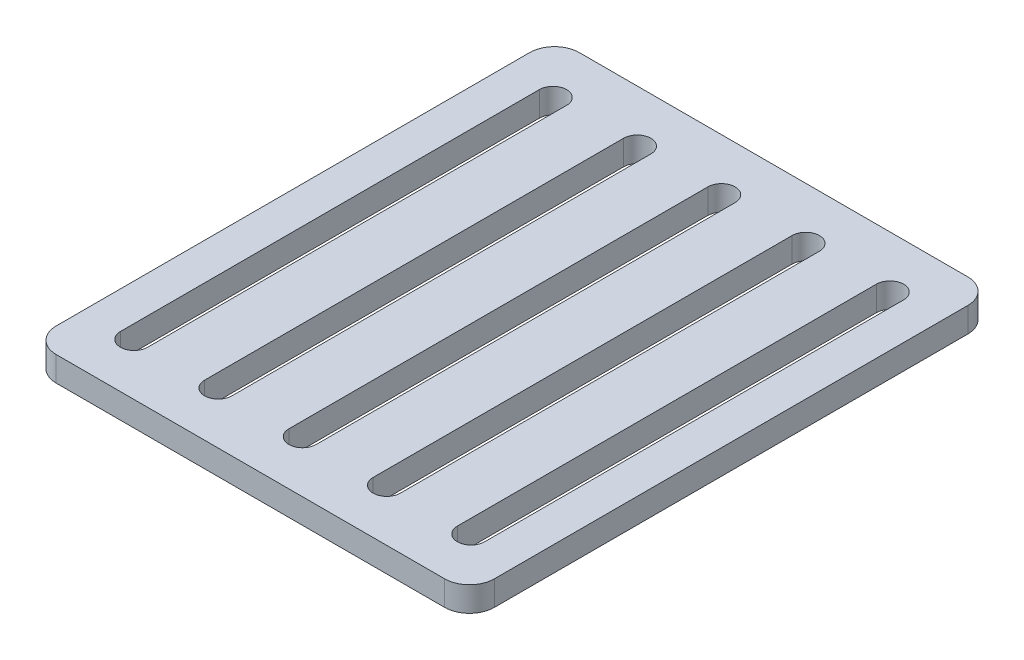
ISO-10303-21;
HEADER;
FILE_DESCRIPTION(('STEP AP214'),'2;1');
FILE_NAME('part.step','',(''),(''),'','','');
FILE_SCHEMA(('AUTOMOTIVE_DESIGN { 1 0 10303 214 1 1 1 1 }'));
ENDSEC;
DATA;
#1=APPLICATION_CONTEXT('core data for automotive mechanical design processes');
#2=APPLICATION_PROTOCOL_DEFINITION('international standard','automotive_design',2000,#1);
#3=PRODUCT_CONTEXT('',#1,'mechanical');
#4=PRODUCT('Part','Part','',(#3));
#5=PRODUCT_RELATED_PRODUCT_CATEGORY('part','',(#4));
#6=PRODUCT_DEFINITION_FORMATION('','',#4);
#7=PRODUCT_DEFINITION_CONTEXT('part definition',#1,'design');
#8=PRODUCT_DEFINITION('design','',#6,#7);
#9=PRODUCT_DEFINITION_SHAPE('','',#8);
#10=(LENGTH_UNIT() NAMED_UNIT(*) SI_UNIT(.MILLI.,.METRE.));
#11=(NAMED_UNIT(*) PLANE_ANGLE_UNIT() SI_UNIT($,.RADIAN.));
#12=(NAMED_UNIT(*) SI_UNIT($,.STERADIAN.) SOLID_ANGLE_UNIT());
#13=UNCERTAINTY_MEASURE_WITH_UNIT(LENGTH_MEASURE(1.E-05),#10,'distance_accuracy_value','');
#14=(GEOMETRIC_REPRESENTATION_CONTEXT(3) GLOBAL_UNCERTAINTY_ASSIGNED_CONTEXT((#13)) GLOBAL_UNIT_ASSIGNED_CONTEXT((#10,
#11,#12)) REPRESENTATION_CONTEXT('',''));
#15=CARTESIAN_POINT('',(0.,0.,0.));
#16=DIRECTION('',(0.,0.,1.));
#17=DIRECTION('',(1.,0.,0.));
#18=AXIS2_PLACEMENT_3D('',#15,#16,#17);
#19=CARTESIAN_POINT('',(44.1988373664787,15.5,0.));
#20=DIRECTION('',(1.,0.,0.));
#21=DIRECTION('',(0.,0.,-1.));
#22=AXIS2_PLACEMENT_3D('',#19,#20,#21);
#23=PLANE('',#22);
#24=DIRECTION('',(0.,0.,1.));
#25=VECTOR('',#24,1.);
#26=CARTESIAN_POINT('',(44.1988373664787,20.5,0.));
#27=LINE('',#26,#25);
#28=CARTESIAN_POINT('',(44.1988373664787,20.5,-52.7238001027068));
#29=VERTEX_POINT('',#28);
#30=CARTESIAN_POINT('',(44.1988373664787,20.5,42.8226002054125));
#31=VERTEX_POINT('',#30);
#32=EDGE_CURVE('E362',#29,#31,#27,.T.);
#33=ORIENTED_EDGE('',*,*,#32,.T.);
#34=DIRECTION('',(0.,-1.,0.));
#35=VECTOR('',#34,1.);
#36=CARTESIAN_POINT('',(44.1988373664787,15.5,42.8226002054125));
#37=LINE('',#36,#35);
#38=CARTESIAN_POINT('',(44.1988373664787,15.5,42.8226002054125));
#39=VERTEX_POINT('',#38);
#40=EDGE_CURVE('E261',#31,#39,#37,.T.);
#41=ORIENTED_EDGE('',*,*,#40,.T.);
#42=DIRECTION('',(0.,0.,1.));
#43=VECTOR('',#42,1.);
#44=CARTESIAN_POINT('',(44.1988373664787,15.5,0.));
#45=LINE('',#44,#43);
#46=CARTESIAN_POINT('',(44.1988373664787,15.5,-52.7238001027068));
#47=VERTEX_POINT('',#46);
#48=EDGE_CURVE('E305',#47,#39,#45,.T.);
#49=ORIENTED_EDGE('',*,*,#48,.F.);
#50=DIRECTION('',(0.,-1.,0.));
#51=VECTOR('',#50,1.);
#52=CARTESIAN_POINT('',(44.1988373664787,15.5,-52.7238001027068));
#53=LINE('',#52,#51);
#54=EDGE_CURVE('E259',#47,#29,#53,.F.);
#55=ORIENTED_EDGE('',*,*,#54,.T.);
#56=EDGE_LOOP('',(#33,#41,#49,#55));
#57=FACE_BOUND('',#56,.T.);
#58=ADVANCED_FACE('F37',(#57),#23,.T.);
#59=CARTESIAN_POINT('',(0.,15.5,-57.7238001027068));
#60=DIRECTION('',(0.,0.,-1.));
#61=DIRECTION('',(-1.,0.,0.));
#62=AXIS2_PLACEMENT_3D('',#59,#60,#61);
#63=PLANE('',#62);
#64=DIRECTION('',(1.,0.,0.));
#65=VECTOR('',#64,1.);
#66=CARTESIAN_POINT('',(0.,20.5,-57.7238001027068));
#67=LINE('',#66,#65);
#68=CARTESIAN_POINT('',(-39.1988373664787,20.5,-57.7238001027068));
#69=VERTEX_POINT('',#68);
#70=CARTESIAN_POINT('',(39.1988373664787,20.5,-57.7238001027068));
#71=VERTEX_POINT('',#70);
#72=EDGE_CURVE('E297',#69,#71,#67,.T.);
#73=ORIENTED_EDGE('',*,*,#72,.T.);
#74=DIRECTION('',(0.,-1.,0.));
#75=VECTOR('',#74,1.);
#76=CARTESIAN_POINT('',(39.1988373664787,15.5,-57.7238001027068));
#77=LINE('',#76,#75);
#78=CARTESIAN_POINT('',(39.1988373664787,15.5,-57.7238001027068));
#79=VERTEX_POINT('',#78);
#80=EDGE_CURVE('E287',#71,#79,#77,.T.);
#81=ORIENTED_EDGE('',*,*,#80,.T.);
#82=DIRECTION('',(1.,0.,0.));
#83=VECTOR('',#82,1.);
#84=CARTESIAN_POINT('',(0.,15.5,-57.7238001027068));
#85=LINE('',#84,#83);
#86=CARTESIAN_POINT('',(-39.1988373664787,15.5,-57.7238001027068));
#87=VERTEX_POINT('',#86);
#88=EDGE_CURVE('E295',#87,#79,#85,.T.);
#89=ORIENTED_EDGE('',*,*,#88,.F.);
#90=DIRECTION('',(0.,-1.,0.));
#91=VECTOR('',#90,1.);
#92=CARTESIAN_POINT('',(-39.1988373664787,20.5,-57.7238001027068));
#93=LINE('',#92,#91);
#94=EDGE_CURVE('E285',#87,#69,#93,.F.);
#95=ORIENTED_EDGE('',*,*,#94,.T.);
#96=EDGE_LOOP('',(#73,#81,#89,#95));
#97=FACE_BOUND('',#96,.T.);
#98=ADVANCED_FACE('F294',(#97),#63,.T.);
#99=CARTESIAN_POINT('',(-44.1988373664787,15.5,0.));
#100=DIRECTION('',(1.,0.,0.));
#101=DIRECTION('',(0.,0.,-1.));
#102=AXIS2_PLACEMENT_3D('',#99,#100,#101);
#103=PLANE('',#102);
#104=DIRECTION('',(0.,0.,1.));
#105=VECTOR('',#104,1.);
#106=CARTESIAN_POINT('',(-44.1988373664787,20.5,0.));
#107=LINE('',#106,#105);
#108=CARTESIAN_POINT('',(-44.1988373664787,20.5,-52.7238001027068));
#109=VERTEX_POINT('',#108);
#110=CARTESIAN_POINT('',(-44.1988373664787,20.5,42.8226002054125));
#111=VERTEX_POINT('',#110);
#112=EDGE_CURVE('E366',#109,#111,#107,.T.);
#113=ORIENTED_EDGE('',*,*,#112,.F.);
#114=DIRECTION('',(0.,-1.,0.));
#115=VECTOR('',#114,1.);
#116=CARTESIAN_POINT('',(-44.1988373664787,15.5,-52.7238001027068));
#117=LINE('',#116,#115);
#118=CARTESIAN_POINT('',(-44.1988373664787,15.5,-52.7238001027068));
#119=VERTEX_POINT('',#118);
#120=EDGE_CURVE('E11',#109,#119,#117,.T.);
#121=ORIENTED_EDGE('',*,*,#120,.T.);
#122=DIRECTION('',(0.,0.,1.));
#123=VECTOR('',#122,1.);
#124=CARTESIAN_POINT('',(-44.1988373664787,15.5,0.));
#125=LINE('',#124,#123);
#126=CARTESIAN_POINT('',(-44.1988373664787,15.5,42.8226002054125));
#127=VERTEX_POINT('',#126);
#128=EDGE_CURVE('E306',#119,#127,#125,.T.);
#129=ORIENTED_EDGE('',*,*,#128,.T.);
#130=DIRECTION('',(0.,-1.,0.));
#131=VECTOR('',#130,1.);
#132=CARTESIAN_POINT('',(-44.1988373664787,15.5,42.8226002054125));
#133=LINE('',#132,#131);
#134=EDGE_CURVE('E45',#127,#111,#133,.F.);
#135=ORIENTED_EDGE('',*,*,#134,.T.);
#136=EDGE_LOOP('',(#113,#121,#129,#135));
#137=FACE_BOUND('',#136,.T.);
#138=ADVANCED_FACE('F493',(#137),#103,.F.);
#139=CARTESIAN_POINT('',(0.,15.5,47.8226002054125));
#140=DIRECTION('',(0.,0.,-1.));
#141=DIRECTION('',(-1.,0.,0.));
#142=AXIS2_PLACEMENT_3D('',#139,#140,#141);
#143=PLANE('',#142);
#144=DIRECTION('',(1.,0.,0.));
#145=VECTOR('',#144,1.);
#146=CARTESIAN_POINT('',(0.,15.5,47.8226002054125));
#147=LINE('',#146,#145);
#148=CARTESIAN_POINT('',(-39.1988373664787,15.5,47.8226002054125));
#149=VERTEX_POINT('',#148);
#150=CARTESIAN_POINT('',(39.1988373664787,15.5,47.8226002054125));
#151=VERTEX_POINT('',#150);
#152=EDGE_CURVE('E309',#149,#151,#147,.T.);
#153=ORIENTED_EDGE('',*,*,#152,.T.);
#154=DIRECTION('',(0.,-1.,0.));
#155=VECTOR('',#154,1.);
#156=CARTESIAN_POINT('',(39.1988373664787,20.5,47.8226002054125));
#157=LINE('',#156,#155);
#158=CARTESIAN_POINT('',(39.1988373664787,20.5,47.8226002054125));
#159=VERTEX_POINT('',#158);
#160=EDGE_CURVE('E276',#151,#159,#157,.F.);
#161=ORIENTED_EDGE('',*,*,#160,.T.);
#162=DIRECTION('',(1.,0.,0.));
#163=VECTOR('',#162,1.);
#164=CARTESIAN_POINT('',(0.,20.5,47.8226002054125));
#165=LINE('',#164,#163);
#166=CARTESIAN_POINT('',(-39.1988373664787,20.5,47.8226002054125));
#167=VERTEX_POINT('',#166);
#168=EDGE_CURVE('E252',#167,#159,#165,.T.);
#169=ORIENTED_EDGE('',*,*,#168,.F.);
#170=DIRECTION('',(0.,-1.,0.));
#171=VECTOR('',#170,1.);
#172=CARTESIAN_POINT('',(-39.1988373664787,15.5,47.8226002054125));
#173=LINE('',#172,#171);
#174=EDGE_CURVE('E273',#167,#149,#173,.T.);
#175=ORIENTED_EDGE('',*,*,#174,.T.);
#176=EDGE_LOOP('',(#153,#161,#169,#175));
#177=FACE_BOUND('',#176,.T.);
#178=ADVANCED_FACE('F517',(#177),#143,.F.);
#179=CARTESIAN_POINT('',(-34.0000000000003,20.5,-47.2238001027059));
#180=DIRECTION('',(0.,-1.,0.));
#181=DIRECTION('',(0.,0.,-1.));
#182=AXIS2_PLACEMENT_3D('',#179,#180,#181);
#183=CYLINDRICAL_SURFACE('',#182,2.75);
#184=CARTESIAN_POINT('',(-34.0000000000003,15.5,-47.2238001027059));
#185=DIRECTION('',(0.,1.,0.));
#186=DIRECTION('',(0.,0.,1.));
#187=AXIS2_PLACEMENT_3D('',#184,#185,#186);
#188=CIRCLE('',#187,2.75);
#189=CARTESIAN_POINT('',(-31.2500000000002,15.5,-47.2238001027059));
#190=VERTEX_POINT('',#189);
#191=CARTESIAN_POINT('',(-36.7500000000003,15.5,-47.2238001027059));
#192=VERTEX_POINT('',#191);
#193=EDGE_CURVE('E401',#190,#192,#188,.T.);
#194=ORIENTED_EDGE('',*,*,#193,.F.);
#195=DIRECTION('',(0.,-1.,0.));
#196=VECTOR('',#195,1.);
#197=CARTESIAN_POINT('',(-31.2500000000002,20.5,-47.2238001027059));
#198=LINE('',#197,#196);
#199=CARTESIAN_POINT('',(-31.2500000000002,20.5,-47.2238001027059));
#200=VERTEX_POINT('',#199);
#201=EDGE_CURVE('E262',#200,#190,#198,.T.);
#202=ORIENTED_EDGE('',*,*,#201,.F.);
#203=CARTESIAN_POINT('',(-34.0000000000003,20.5,-47.2238001027059));
#204=DIRECTION('',(0.,1.,0.));
#205=DIRECTION('',(0.,0.,1.));
#206=AXIS2_PLACEMENT_3D('',#203,#204,#205);
#207=CIRCLE('',#206,2.75);
#208=CARTESIAN_POINT('',(-36.7500000000003,20.5,-47.2238001027059));
#209=VERTEX_POINT('',#208);
#210=EDGE_CURVE('E352',#200,#209,#207,.T.);
#211=ORIENTED_EDGE('',*,*,#210,.T.);
#212=DIRECTION('',(0.,-1.,0.));
#213=VECTOR('',#212,1.);
#214=CARTESIAN_POINT('',(-36.7500000000003,20.5,-47.2238001027059));
#215=LINE('',#214,#213);
#216=EDGE_CURVE('E410',#209,#192,#215,.T.);
#217=ORIENTED_EDGE('',*,*,#216,.T.);
#218=EDGE_LOOP('',(#194,#202,#211,#217));
#219=FACE_BOUND('',#218,.T.);
#220=ADVANCED_FACE('F544',(#219),#183,.F.);
#221=CARTESIAN_POINT('',(-31.2499999999998,20.5,3.12899578364497E-13));
#222=DIRECTION('',(1.,0.,0.));
#223=DIRECTION('',(0.,0.,-1.));
#224=AXIS2_PLACEMENT_3D('',#221,#222,#223);
#225=PLANE('',#224);
#226=DIRECTION('',(0.,0.,1.));
#227=VECTOR('',#226,1.);
#228=CARTESIAN_POINT('',(-31.2499999999998,15.5,3.12899578364497E-13));
#229=LINE('',#228,#227);
#230=CARTESIAN_POINT('',(-31.2499999999994,15.5,37.3226002054122));
#231=VERTEX_POINT('',#230);
#232=EDGE_CURVE('E403',#190,#231,#229,.T.);
#233=ORIENTED_EDGE('',*,*,#232,.T.);
#234=DIRECTION('',(0.,-1.,0.));
#235=VECTOR('',#234,1.);
#236=CARTESIAN_POINT('',(-31.2499999999994,20.5,37.3226002054122));
#237=LINE('',#236,#235);
#238=CARTESIAN_POINT('',(-31.2499999999994,20.5,37.3226002054122));
#239=VERTEX_POINT('',#238);
#240=EDGE_CURVE('E417',#239,#231,#237,.T.);
#241=ORIENTED_EDGE('',*,*,#240,.F.);
#242=DIRECTION('',(0.,0.,1.));
#243=VECTOR('',#242,1.);
#244=CARTESIAN_POINT('',(-31.2499999999998,20.5,3.12899578364497E-13));
#245=LINE('',#244,#243);
#246=EDGE_CURVE('E355',#200,#239,#245,.T.);
#247=ORIENTED_EDGE('',*,*,#246,.F.);
#248=ORIENTED_EDGE('',*,*,#201,.T.);
#249=EDGE_LOOP('',(#233,#241,#247,#248));
#250=FACE_BOUND('',#249,.T.);
#251=ADVANCED_FACE('F540',(#250),#225,.F.);
#252=CARTESIAN_POINT('',(-33.9999999999994,20.5,37.3226002054122));
#253=DIRECTION('',(0.,-1.,0.));
#254=DIRECTION('',(0.,0.,-1.));
#255=AXIS2_PLACEMENT_3D('',#252,#253,#254);
#256=CYLINDRICAL_SURFACE('',#255,2.75);
#257=CARTESIAN_POINT('',(-33.9999999999994,15.5,37.3226002054122));
#258=DIRECTION('',(0.,1.,0.));
#259=DIRECTION('',(0.,0.,1.));
#260=AXIS2_PLACEMENT_3D('',#257,#258,#259);
#261=CIRCLE('',#260,2.75);
#262=CARTESIAN_POINT('',(-36.7499999999994,15.5,37.3226002054122));
#263=VERTEX_POINT('',#262);
#264=EDGE_CURVE('E406',#263,#231,#261,.T.);
#265=ORIENTED_EDGE('',*,*,#264,.F.);
#266=DIRECTION('',(0.,-1.,0.));
#267=VECTOR('',#266,1.);
#268=CARTESIAN_POINT('',(-36.7499999999994,20.5,37.3226002054122));
#269=LINE('',#268,#267);
#270=CARTESIAN_POINT('',(-36.7499999999994,20.5,37.3226002054122));
#271=VERTEX_POINT('',#270);
#272=EDGE_CURVE('E413',#271,#263,#269,.T.);
#273=ORIENTED_EDGE('',*,*,#272,.F.);
#274=CARTESIAN_POINT('',(-33.9999999999994,20.5,37.3226002054122));
#275=DIRECTION('',(0.,1.,0.));
#276=DIRECTION('',(0.,0.,1.));
#277=AXIS2_PLACEMENT_3D('',#274,#275,#276);
#278=CIRCLE('',#277,2.75);
#279=EDGE_CURVE('E357',#271,#239,#278,.T.);
#280=ORIENTED_EDGE('',*,*,#279,.T.);
#281=ORIENTED_EDGE('',*,*,#240,.T.);
#282=EDGE_LOOP('',(#265,#273,#280,#281));
#283=FACE_BOUND('',#282,.T.);
#284=ADVANCED_FACE('F536',(#283),#256,.F.);
#285=CARTESIAN_POINT('',(-17.0000000000004,20.5,-47.2238001027059));
#286=DIRECTION('',(0.,-1.,0.));
#287=DIRECTION('',(0.,0.,-1.));
#288=AXIS2_PLACEMENT_3D('',#285,#286,#287);
#289=CYLINDRICAL_SURFACE('',#288,2.75);
#290=CARTESIAN_POINT('',(-17.0000000000004,15.5,-47.2238001027059));
#291=DIRECTION('',(0.,1.,0.));
#292=DIRECTION('',(0.,0.,1.));
#293=AXIS2_PLACEMENT_3D('',#290,#291,#292);
#294=CIRCLE('',#293,2.75);
#295=CARTESIAN_POINT('',(-14.2500000000004,15.5,-47.2238001027059));
#296=VERTEX_POINT('',#295);
#297=CARTESIAN_POINT('',(-19.7500000000004,15.5,-47.2238001027059));
#298=VERTEX_POINT('',#297);
#299=EDGE_CURVE('E391',#296,#298,#294,.T.);
#300=ORIENTED_EDGE('',*,*,#299,.F.);
#301=DIRECTION('',(0.,-1.,0.));
#302=VECTOR('',#301,1.);
#303=CARTESIAN_POINT('',(-14.2500000000004,20.5,-47.2238001027059));
#304=LINE('',#303,#302);
#305=CARTESIAN_POINT('',(-14.2500000000004,20.5,-47.2238001027059));
#306=VERTEX_POINT('',#305);
#307=EDGE_CURVE('E414',#306,#296,#304,.T.);
#308=ORIENTED_EDGE('',*,*,#307,.F.);
#309=CARTESIAN_POINT('',(-17.0000000000004,20.5,-47.2238001027059));
#310=DIRECTION('',(0.,1.,0.));
#311=DIRECTION('',(0.,0.,1.));
#312=AXIS2_PLACEMENT_3D('',#309,#310,#311);
#313=CIRCLE('',#312,2.75);
#314=CARTESIAN_POINT('',(-19.7500000000004,20.5,-47.2238001027059));
#315=VERTEX_POINT('',#314);
#316=EDGE_CURVE('E342',#306,#315,#313,.T.);
#317=ORIENTED_EDGE('',*,*,#316,.T.);
#318=DIRECTION('',(0.,-1.,0.));
#319=VECTOR('',#318,1.);
#320=CARTESIAN_POINT('',(-19.7500000000004,20.5,-47.2238001027059));
#321=LINE('',#320,#319);
#322=EDGE_CURVE('E422',#315,#298,#321,.T.);
#323=ORIENTED_EDGE('',*,*,#322,.T.);
#324=EDGE_LOOP('',(#300,#308,#317,#323));
#325=FACE_BOUND('',#324,.T.);
#326=ADVANCED_FACE('F539',(#325),#289,.F.);
#327=CARTESIAN_POINT('',(-14.2499999999999,20.5,1.42682207734211E-13));
#328=DIRECTION('',(1.,0.,0.));
#329=DIRECTION('',(0.,0.,-1.));
#330=AXIS2_PLACEMENT_3D('',#327,#328,#329);
#331=PLANE('',#330);
#332=DIRECTION('',(0.,0.,1.));
#333=VECTOR('',#332,1.);
#334=CARTESIAN_POINT('',(-14.2499999999999,15.5,1.42682207734211E-13));
#335=LINE('',#334,#333);
#336=CARTESIAN_POINT('',(-14.2499999999996,15.5,37.3226002054122));
#337=VERTEX_POINT('',#336);
#338=EDGE_CURVE('E393',#296,#337,#335,.T.);
#339=ORIENTED_EDGE('',*,*,#338,.T.);
#340=DIRECTION('',(0.,-1.,0.));
#341=VECTOR('',#340,1.);
#342=CARTESIAN_POINT('',(-14.2499999999996,20.5,37.3226002054122));
#343=LINE('',#342,#341);
#344=CARTESIAN_POINT('',(-14.2499999999996,20.5,37.3226002054122));
#345=VERTEX_POINT('',#344);
#346=EDGE_CURVE('E429',#345,#337,#343,.T.);
#347=ORIENTED_EDGE('',*,*,#346,.F.);
#348=DIRECTION('',(0.,0.,1.));
#349=VECTOR('',#348,1.);
#350=CARTESIAN_POINT('',(-14.2499999999999,20.5,1.42682207734211E-13));
#351=LINE('',#350,#349);
#352=EDGE_CURVE('E345',#306,#345,#351,.T.);
#353=ORIENTED_EDGE('',*,*,#352,.F.);
#354=ORIENTED_EDGE('',*,*,#307,.T.);
#355=EDGE_LOOP('',(#339,#347,#353,#354));
#356=FACE_BOUND('',#355,.T.);
#357=ADVANCED_FACE('F556',(#356),#331,.F.);
#358=CARTESIAN_POINT('',(-16.9999999999996,20.5,37.3226002054122));
#359=DIRECTION('',(0.,-1.,0.));
#360=DIRECTION('',(0.,0.,-1.));
#361=AXIS2_PLACEMENT_3D('',#358,#359,#360);
#362=CYLINDRICAL_SURFACE('',#361,2.75);
#363=CARTESIAN_POINT('',(-16.9999999999996,15.5,37.3226002054122));
#364=DIRECTION('',(0.,1.,0.));
#365=DIRECTION('',(0.,0.,1.));
#366=AXIS2_PLACEMENT_3D('',#363,#364,#365);
#367=CIRCLE('',#366,2.75);
#368=CARTESIAN_POINT('',(-19.7499999999996,15.5,37.3226002054122));
#369=VERTEX_POINT('',#368);
#370=EDGE_CURVE('E396',#369,#337,#367,.T.);
#371=ORIENTED_EDGE('',*,*,#370,.F.);
#372=DIRECTION('',(0.,-1.,0.));
#373=VECTOR('',#372,1.);
#374=CARTESIAN_POINT('',(-19.7499999999996,20.5,37.3226002054122));
#375=LINE('',#374,#373);
#376=CARTESIAN_POINT('',(-19.7499999999996,20.5,37.3226002054122));
#377=VERTEX_POINT('',#376);
#378=EDGE_CURVE('E425',#377,#369,#375,.T.);
#379=ORIENTED_EDGE('',*,*,#378,.F.);
#380=CARTESIAN_POINT('',(-16.9999999999996,20.5,37.3226002054122));
#381=DIRECTION('',(0.,1.,0.));
#382=DIRECTION('',(0.,0.,1.));
#383=AXIS2_PLACEMENT_3D('',#380,#381,#382);
#384=CIRCLE('',#383,2.75);
#385=EDGE_CURVE('E347',#377,#345,#384,.T.);
#386=ORIENTED_EDGE('',*,*,#385,.T.);
#387=ORIENTED_EDGE('',*,*,#346,.T.);
#388=EDGE_LOOP('',(#371,#379,#386,#387));
#389=FACE_BOUND('',#388,.T.);
#390=ADVANCED_FACE('F552',(#389),#362,.F.);
#391=CARTESIAN_POINT('',(-5.68989300120393E-13,20.5,-47.2238001027059));
#392=DIRECTION('',(0.,-1.,0.));
#393=DIRECTION('',(0.,0.,-1.));
#394=AXIS2_PLACEMENT_3D('',#391,#392,#393);
#395=CYLINDRICAL_SURFACE('',#394,2.75);
#396=CARTESIAN_POINT('',(-5.68989300120393E-13,15.5,-47.2238001027059));
#397=DIRECTION('',(0.,1.,0.));
#398=DIRECTION('',(0.,0.,1.));
#399=AXIS2_PLACEMENT_3D('',#396,#397,#398);
#400=CIRCLE('',#399,2.75);
#401=CARTESIAN_POINT('',(2.74999999999943,15.5,-47.2238001027059));
#402=VERTEX_POINT('',#401);
#403=CARTESIAN_POINT('',(-2.75000000000057,15.5,-47.2238001027059));
#404=VERTEX_POINT('',#403);
#405=EDGE_CURVE('E381',#402,#404,#400,.T.);
#406=ORIENTED_EDGE('',*,*,#405,.F.);
#407=DIRECTION('',(0.,-1.,0.));
#408=VECTOR('',#407,1.);
#409=CARTESIAN_POINT('',(2.74999999999943,20.5,-47.2238001027059));
#410=LINE('',#409,#408);
#411=CARTESIAN_POINT('',(2.74999999999943,20.5,-47.2238001027059));
#412=VERTEX_POINT('',#411);
#413=EDGE_CURVE('E426',#412,#402,#410,.T.);
#414=ORIENTED_EDGE('',*,*,#413,.F.);
#415=CARTESIAN_POINT('',(-5.68989300120393E-13,20.5,-47.2238001027059));
#416=DIRECTION('',(0.,1.,0.));
#417=DIRECTION('',(0.,0.,1.));
#418=AXIS2_PLACEMENT_3D('',#415,#416,#417);
#419=CIRCLE('',#418,2.75);
#420=CARTESIAN_POINT('',(-2.75000000000057,20.5,-47.2238001027059));
#421=VERTEX_POINT('',#420);
#422=EDGE_CURVE('E332',#412,#421,#419,.T.);
#423=ORIENTED_EDGE('',*,*,#422,.T.);
#424=DIRECTION('',(0.,-1.,0.));
#425=VECTOR('',#424,1.);
#426=CARTESIAN_POINT('',(-2.75000000000057,20.5,-47.2238001027059));
#427=LINE('',#426,#425);
#428=EDGE_CURVE('E434',#421,#404,#427,.T.);
#429=ORIENTED_EDGE('',*,*,#428,.T.);
#430=EDGE_LOOP('',(#406,#414,#423,#429));
#431=FACE_BOUND('',#430,.T.);
#432=ADVANCED_FACE('F555',(#431),#395,.F.);
#433=CARTESIAN_POINT('',(2.74999999999991,20.5,0.));
#434=DIRECTION('',(1.,0.,0.));
#435=DIRECTION('',(0.,0.,-1.));
#436=AXIS2_PLACEMENT_3D('',#433,#434,#435);
#437=PLANE('',#436);
#438=DIRECTION('',(0.,0.,1.));
#439=VECTOR('',#438,1.);
#440=CARTESIAN_POINT('',(2.74999999999991,15.5,0.));
#441=LINE('',#440,#439);
#442=CARTESIAN_POINT('',(2.75000000000028,15.5,37.3226002054122));
#443=VERTEX_POINT('',#442);
#444=EDGE_CURVE('E383',#402,#443,#441,.T.);
#445=ORIENTED_EDGE('',*,*,#444,.T.);
#446=DIRECTION('',(0.,-1.,0.));
#447=VECTOR('',#446,1.);
#448=CARTESIAN_POINT('',(2.75000000000028,20.5,37.3226002054122));
#449=LINE('',#448,#447);
#450=CARTESIAN_POINT('',(2.75000000000028,20.5,37.3226002054122));
#451=VERTEX_POINT('',#450);
#452=EDGE_CURVE('E441',#451,#443,#449,.T.);
#453=ORIENTED_EDGE('',*,*,#452,.F.);
#454=DIRECTION('',(0.,0.,1.));
#455=VECTOR('',#454,1.);
#456=CARTESIAN_POINT('',(2.74999999999991,20.5,0.));
#457=LINE('',#456,#455);
#458=EDGE_CURVE('E335',#412,#451,#457,.T.);
#459=ORIENTED_EDGE('',*,*,#458,.F.);
#460=ORIENTED_EDGE('',*,*,#413,.T.);
#461=EDGE_LOOP('',(#445,#453,#459,#460));
#462=FACE_BOUND('',#461,.T.);
#463=ADVANCED_FACE('F567',(#462),#437,.F.);
#464=CARTESIAN_POINT('',(2.77555756156289E-13,20.5,37.3226002054122));
#465=DIRECTION('',(0.,-1.,0.));
#466=DIRECTION('',(0.,0.,-1.));
#467=AXIS2_PLACEMENT_3D('',#464,#465,#466);
#468=CYLINDRICAL_SURFACE('',#467,2.75);
#469=CARTESIAN_POINT('',(2.77555756156289E-13,15.5,37.3226002054122));
#470=DIRECTION('',(0.,1.,0.));
#471=DIRECTION('',(0.,0.,1.));
#472=AXIS2_PLACEMENT_3D('',#469,#470,#471);
#473=CIRCLE('',#472,2.75);
#474=CARTESIAN_POINT('',(-2.74999999999972,15.5,37.3226002054122));
#475=VERTEX_POINT('',#474);
#476=EDGE_CURVE('E386',#475,#443,#473,.T.);
#477=ORIENTED_EDGE('',*,*,#476,.F.);
#478=DIRECTION('',(0.,-1.,0.));
#479=VECTOR('',#478,1.);
#480=CARTESIAN_POINT('',(-2.74999999999972,20.5,37.3226002054122));
#481=LINE('',#480,#479);
#482=CARTESIAN_POINT('',(-2.74999999999972,20.5,37.3226002054122));
#483=VERTEX_POINT('',#482);
#484=EDGE_CURVE('E437',#483,#475,#481,.T.);
#485=ORIENTED_EDGE('',*,*,#484,.F.);
#486=CARTESIAN_POINT('',(2.77555756156289E-13,20.5,37.3226002054122));
#487=DIRECTION('',(0.,1.,0.));
#488=DIRECTION('',(0.,0.,1.));
#489=AXIS2_PLACEMENT_3D('',#486,#487,#488);
#490=CIRCLE('',#489,2.75);
#491=EDGE_CURVE('E337',#483,#451,#490,.T.);
#492=ORIENTED_EDGE('',*,*,#491,.T.);
#493=ORIENTED_EDGE('',*,*,#452,.T.);
#494=EDGE_LOOP('',(#477,#485,#492,#493));
#495=FACE_BOUND('',#494,.T.);
#496=ADVANCED_FACE('F564',(#495),#468,.F.);
#497=CARTESIAN_POINT('',(16.9999999999993,20.5,-47.2238001027059));
#498=DIRECTION('',(0.,-1.,0.));
#499=DIRECTION('',(0.,0.,-1.));
#500=AXIS2_PLACEMENT_3D('',#497,#498,#499);
#501=CYLINDRICAL_SURFACE('',#500,2.75);
#502=CARTESIAN_POINT('',(16.9999999999993,15.5,-47.2238001027059));
#503=DIRECTION('',(0.,1.,0.));
#504=DIRECTION('',(0.,0.,1.));
#505=AXIS2_PLACEMENT_3D('',#502,#503,#504);
#506=CIRCLE('',#505,2.75);
#507=CARTESIAN_POINT('',(19.7499999999993,15.5,-47.2238001027059));
#508=VERTEX_POINT('',#507);
#509=CARTESIAN_POINT('',(14.2499999999993,15.5,-47.2238001027059));
#510=VERTEX_POINT('',#509);
#511=EDGE_CURVE('E233',#508,#510,#506,.T.);
#512=ORIENTED_EDGE('',*,*,#511,.F.);
#513=DIRECTION('',(0.,-1.,0.));
#514=VECTOR('',#513,1.);
#515=CARTESIAN_POINT('',(19.7499999999993,20.5,-47.2238001027059));
#516=LINE('',#515,#514);
#517=CARTESIAN_POINT('',(19.7499999999993,20.5,-47.2238001027059));
#518=VERTEX_POINT('',#517);
#519=EDGE_CURVE('E438',#518,#508,#516,.T.);
#520=ORIENTED_EDGE('',*,*,#519,.F.);
#521=CARTESIAN_POINT('',(16.9999999999993,20.5,-47.2238001027059));
#522=DIRECTION('',(0.,1.,0.));
#523=DIRECTION('',(0.,0.,1.));
#524=AXIS2_PLACEMENT_3D('',#521,#522,#523);
#525=CIRCLE('',#524,2.75);
#526=CARTESIAN_POINT('',(14.2499999999993,20.5,-47.2238001027059));
#527=VERTEX_POINT('',#526);
#528=EDGE_CURVE('E322',#518,#527,#525,.T.);
#529=ORIENTED_EDGE('',*,*,#528,.T.);
#530=DIRECTION('',(0.,-1.,0.));
#531=VECTOR('',#530,1.);
#532=CARTESIAN_POINT('',(14.2499999999993,20.5,-47.2238001027059));
#533=LINE('',#532,#531);
#534=EDGE_CURVE('E258',#527,#510,#533,.T.);
#535=ORIENTED_EDGE('',*,*,#534,.T.);
#536=EDGE_LOOP('',(#512,#520,#529,#535));
#537=FACE_BOUND('',#536,.T.);
#538=ADVANCED_FACE('F461',(#537),#501,.F.);
#539=CARTESIAN_POINT('',(19.7499999999997,20.5,-1.97752533526361E-13));
#540=DIRECTION('',(1.,0.,0.));
#541=DIRECTION('',(0.,0.,-1.));
#542=AXIS2_PLACEMENT_3D('',#539,#540,#541);
#543=PLANE('',#542);
#544=DIRECTION('',(0.,0.,1.));
#545=VECTOR('',#544,1.);
#546=CARTESIAN_POINT('',(19.7499999999997,15.5,-1.97752533526361E-13));
#547=LINE('',#546,#545);
#548=CARTESIAN_POINT('',(19.7500000000001,15.5,37.3226002054122));
#549=VERTEX_POINT('',#548);
#550=EDGE_CURVE('E373',#508,#549,#547,.T.);
#551=ORIENTED_EDGE('',*,*,#550,.T.);
#552=DIRECTION('',(0.,-1.,0.));
#553=VECTOR('',#552,1.);
#554=CARTESIAN_POINT('',(19.7500000000001,20.5,37.3226002054122));
#555=LINE('',#554,#553);
#556=CARTESIAN_POINT('',(19.7500000000001,20.5,37.3226002054122));
#557=VERTEX_POINT('',#556);
#558=EDGE_CURVE('E451',#557,#549,#555,.T.);
#559=ORIENTED_EDGE('',*,*,#558,.F.);
#560=DIRECTION('',(0.,0.,1.));
#561=VECTOR('',#560,1.);
#562=CARTESIAN_POINT('',(19.7499999999997,20.5,-1.97752533526361E-13));
#563=LINE('',#562,#561);
#564=EDGE_CURVE('E325',#518,#557,#563,.T.);
#565=ORIENTED_EDGE('',*,*,#564,.F.);
#566=ORIENTED_EDGE('',*,*,#519,.T.);
#567=EDGE_LOOP('',(#551,#559,#565,#566));
#568=FACE_BOUND('',#567,.T.);
#569=ADVANCED_FACE('F457',(#568),#543,.F.);
#570=CARTESIAN_POINT('',(17.0000000000001,20.5,37.3226002054122));
#571=DIRECTION('',(0.,-1.,0.));
#572=DIRECTION('',(0.,0.,-1.));
#573=AXIS2_PLACEMENT_3D('',#570,#571,#572);
#574=CYLINDRICAL_SURFACE('',#573,2.75);
#575=CARTESIAN_POINT('',(17.0000000000001,15.5,37.3226002054122));
#576=DIRECTION('',(0.,1.,0.));
#577=DIRECTION('',(0.,0.,1.));
#578=AXIS2_PLACEMENT_3D('',#575,#576,#577);
#579=CIRCLE('',#578,2.75);
#580=CARTESIAN_POINT('',(14.2500000000001,15.5,37.3226002054122));
#581=VERTEX_POINT('',#580);
#582=EDGE_CURVE('E376',#581,#549,#579,.T.);
#583=ORIENTED_EDGE('',*,*,#582,.F.);
#584=DIRECTION('',(0.,-1.,0.));
#585=VECTOR('',#584,1.);
#586=CARTESIAN_POINT('',(14.2500000000001,20.5,37.3226002054122));
#587=LINE('',#586,#585);
#588=CARTESIAN_POINT('',(14.2500000000001,20.5,37.3226002054122));
#589=VERTEX_POINT('',#588);
#590=EDGE_CURVE('E448',#589,#581,#587,.T.);
#591=ORIENTED_EDGE('',*,*,#590,.F.);
#592=CARTESIAN_POINT('',(17.0000000000001,20.5,37.3226002054122));
#593=DIRECTION('',(0.,1.,0.));
#594=DIRECTION('',(0.,0.,1.));
#595=AXIS2_PLACEMENT_3D('',#592,#593,#594);
#596=CIRCLE('',#595,2.75);
#597=EDGE_CURVE('E327',#589,#557,#596,.T.);
#598=ORIENTED_EDGE('',*,*,#597,.T.);
#599=ORIENTED_EDGE('',*,*,#558,.T.);
#600=EDGE_LOOP('',(#583,#591,#598,#599));
#601=FACE_BOUND('',#600,.T.);
#602=ADVANCED_FACE('F466',(#601),#574,.F.);
#603=CARTESIAN_POINT('',(33.9999999999991,20.5,-47.2238001027059));
#604=DIRECTION('',(0.,-1.,0.));
#605=DIRECTION('',(0.,0.,-1.));
#606=AXIS2_PLACEMENT_3D('',#603,#604,#605);
#607=CYLINDRICAL_SURFACE('',#606,2.75);
#608=CARTESIAN_POINT('',(33.9999999999991,15.5,-47.2238001027059));
#609=DIRECTION('',(0.,1.,0.));
#610=DIRECTION('',(0.,0.,1.));
#611=AXIS2_PLACEMENT_3D('',#608,#609,#610);
#612=CIRCLE('',#611,2.75);
#613=CARTESIAN_POINT('',(36.7499999999991,15.5,-47.2238001027059));
#614=VERTEX_POINT('',#613);
#615=CARTESIAN_POINT('',(31.2499999999991,15.5,-47.2238001027059));
#616=VERTEX_POINT('',#615);
#617=EDGE_CURVE('E228',#614,#616,#612,.T.);
#618=ORIENTED_EDGE('',*,*,#617,.F.);
#619=DIRECTION('',(0.,-1.,0.));
#620=VECTOR('',#619,1.);
#621=CARTESIAN_POINT('',(36.7499999999991,20.5,-47.2238001027059));
#622=LINE('',#621,#620);
#623=CARTESIAN_POINT('',(36.7499999999991,20.5,-47.2238001027059));
#624=VERTEX_POINT('',#623);
#625=EDGE_CURVE('E250',#624,#614,#622,.T.);
#626=ORIENTED_EDGE('',*,*,#625,.F.);
#627=CARTESIAN_POINT('',(33.9999999999991,20.5,-47.2238001027059));
#628=DIRECTION('',(0.,1.,0.));
#629=DIRECTION('',(0.,0.,1.));
#630=AXIS2_PLACEMENT_3D('',#627,#628,#629);
#631=CIRCLE('',#630,2.75);
#632=CARTESIAN_POINT('',(31.2499999999991,20.5,-47.2238001027059));
#633=VERTEX_POINT('',#632);
#634=EDGE_CURVE('E313',#624,#633,#631,.T.);
#635=ORIENTED_EDGE('',*,*,#634,.T.);
#636=DIRECTION('',(0.,-1.,0.));
#637=VECTOR('',#636,1.);
#638=CARTESIAN_POINT('',(31.2499999999991,20.5,-47.2238001027059));
#639=LINE('',#638,#637);
#640=EDGE_CURVE('E248',#633,#616,#639,.T.);
#641=ORIENTED_EDGE('',*,*,#640,.T.);
#642=EDGE_LOOP('',(#618,#626,#635,#641));
#643=FACE_BOUND('',#642,.T.);
#644=ADVANCED_FACE('F631',(#643),#607,.F.);
#645=CARTESIAN_POINT('',(36.7499999999996,20.5,-3.67969904156647E-13));
#646=DIRECTION('',(1.,0.,0.));
#647=DIRECTION('',(0.,0.,-1.));
#648=AXIS2_PLACEMENT_3D('',#645,#646,#647);
#649=PLANE('',#648);
#650=DIRECTION('',(0.,0.,1.));
#651=VECTOR('',#650,1.);
#652=CARTESIAN_POINT('',(36.7499999999996,15.5,-3.67969904156647E-13));
#653=LINE('',#652,#651);
#654=CARTESIAN_POINT('',(36.75,15.5,37.3226002054122));
#655=VERTEX_POINT('',#654);
#656=EDGE_CURVE('E243',#614,#655,#653,.T.);
#657=ORIENTED_EDGE('',*,*,#656,.T.);
#658=DIRECTION('',(0.,-1.,0.));
#659=VECTOR('',#658,1.);
#660=CARTESIAN_POINT('',(36.75,20.5,37.3226002054122));
#661=LINE('',#660,#659);
#662=CARTESIAN_POINT('',(36.75,20.5,37.3226002054122));
#663=VERTEX_POINT('',#662);
#664=EDGE_CURVE('E241',#663,#655,#661,.T.);
#665=ORIENTED_EDGE('',*,*,#664,.F.);
#666=DIRECTION('',(0.,0.,1.));
#667=VECTOR('',#666,1.);
#668=CARTESIAN_POINT('',(36.7499999999996,20.5,-3.67969904156647E-13));
#669=LINE('',#668,#667);
#670=EDGE_CURVE('E316',#624,#663,#669,.T.);
#671=ORIENTED_EDGE('',*,*,#670,.F.);
#672=ORIENTED_EDGE('',*,*,#625,.T.);
#673=EDGE_LOOP('',(#657,#665,#671,#672));
#674=FACE_BOUND('',#673,.T.);
#675=ADVANCED_FACE('F637',(#674),#649,.F.);
#676=CARTESIAN_POINT('',(34.,20.5,37.3226002054122));
#677=DIRECTION('',(0.,-1.,0.));
#678=DIRECTION('',(0.,0.,-1.));
#679=AXIS2_PLACEMENT_3D('',#676,#677,#678);
#680=CYLINDRICAL_SURFACE('',#679,2.75);
#681=CARTESIAN_POINT('',(34.,15.5,37.3226002054122));
#682=DIRECTION('',(0.,1.,0.));
#683=DIRECTION('',(0.,0.,1.));
#684=AXIS2_PLACEMENT_3D('',#681,#682,#683);
#685=CIRCLE('',#684,2.75);
#686=CARTESIAN_POINT('',(31.25,15.5,37.3226002054122));
#687=VERTEX_POINT('',#686);
#688=EDGE_CURVE('E225',#687,#655,#685,.T.);
#689=ORIENTED_EDGE('',*,*,#688,.F.);
#690=DIRECTION('',(0.,-1.,0.));
#691=VECTOR('',#690,1.);
#692=CARTESIAN_POINT('',(31.25,20.5,37.3226002054122));
#693=LINE('',#692,#691);
#694=CARTESIAN_POINT('',(31.25,20.5,37.3226002054122));
#695=VERTEX_POINT('',#694);
#696=EDGE_CURVE('E238',#695,#687,#693,.T.);
#697=ORIENTED_EDGE('',*,*,#696,.F.);
#698=CARTESIAN_POINT('',(34.,20.5,37.3226002054122));
#699=DIRECTION('',(0.,1.,0.));
#700=DIRECTION('',(0.,0.,1.));
#701=AXIS2_PLACEMENT_3D('',#698,#699,#700);
#702=CIRCLE('',#701,2.75);
#703=EDGE_CURVE('E319',#695,#663,#702,.T.);
#704=ORIENTED_EDGE('',*,*,#703,.T.);
#705=ORIENTED_EDGE('',*,*,#664,.T.);
#706=EDGE_LOOP('',(#689,#697,#704,#705));
#707=FACE_BOUND('',#706,.T.);
#708=ADVANCED_FACE('F236',(#707),#680,.F.);
#709=CARTESIAN_POINT('',(-36.7499999999998,20.5,3.67969904156649E-13));
#710=DIRECTION('',(-1.,0.,0.));
#711=DIRECTION('',(0.,0.,1.));
#712=AXIS2_PLACEMENT_3D('',#709,#710,#711);
#713=PLANE('',#712);
#714=DIRECTION('',(0.,0.,-1.));
#715=VECTOR('',#714,1.);
#716=CARTESIAN_POINT('',(-36.7499999999998,15.5,3.67969904156649E-13));
#717=LINE('',#716,#715);
#718=EDGE_CURVE('E317',#263,#192,#717,.T.);
#719=ORIENTED_EDGE('',*,*,#718,.T.);
#720=ORIENTED_EDGE('',*,*,#216,.F.);
#721=DIRECTION('',(0.,0.,-1.));
#722=VECTOR('',#721,1.);
#723=CARTESIAN_POINT('',(-36.7499999999998,20.5,3.67969904156649E-13));
#724=LINE('',#723,#722);
#725=EDGE_CURVE('E360',#271,#209,#724,.T.);
#726=ORIENTED_EDGE('',*,*,#725,.F.);
#727=ORIENTED_EDGE('',*,*,#272,.T.);
#728=EDGE_LOOP('',(#719,#720,#726,#727));
#729=FACE_BOUND('',#728,.T.);
#730=ADVANCED_FACE('F532',(#729),#713,.F.);
#731=CARTESIAN_POINT('',(-19.7499999999999,20.5,1.97752533526363E-13));
#732=DIRECTION('',(-1.,0.,0.));
#733=DIRECTION('',(0.,0.,1.));
#734=AXIS2_PLACEMENT_3D('',#731,#732,#733);
#735=PLANE('',#734);
#736=DIRECTION('',(0.,0.,-1.));
#737=VECTOR('',#736,1.);
#738=CARTESIAN_POINT('',(-19.7499999999999,15.5,1.97752533526363E-13));
#739=LINE('',#738,#737);
#740=EDGE_CURVE('E398',#369,#298,#739,.T.);
#741=ORIENTED_EDGE('',*,*,#740,.T.);
#742=ORIENTED_EDGE('',*,*,#322,.F.);
#743=DIRECTION('',(0.,0.,-1.));
#744=VECTOR('',#743,1.);
#745=CARTESIAN_POINT('',(-19.7499999999999,20.5,1.97752533526363E-13));
#746=LINE('',#745,#744);
#747=EDGE_CURVE('E350',#377,#315,#746,.T.);
#748=ORIENTED_EDGE('',*,*,#747,.F.);
#749=ORIENTED_EDGE('',*,*,#378,.T.);
#750=EDGE_LOOP('',(#741,#742,#748,#749));
#751=FACE_BOUND('',#750,.T.);
#752=ADVANCED_FACE('F482',(#751),#735,.F.);
#753=CARTESIAN_POINT('',(-2.7500000000001,20.5,0.));
#754=DIRECTION('',(-1.,0.,0.));
#755=DIRECTION('',(0.,0.,1.));
#756=AXIS2_PLACEMENT_3D('',#753,#754,#755);
#757=PLANE('',#756);
#758=DIRECTION('',(0.,0.,-1.));
#759=VECTOR('',#758,1.);
#760=CARTESIAN_POINT('',(-2.7500000000001,15.5,0.));
#761=LINE('',#760,#759);
#762=EDGE_CURVE('E388',#475,#404,#761,.T.);
#763=ORIENTED_EDGE('',*,*,#762,.T.);
#764=ORIENTED_EDGE('',*,*,#428,.F.);
#765=DIRECTION('',(0.,0.,-1.));
#766=VECTOR('',#765,1.);
#767=CARTESIAN_POINT('',(-2.7500000000001,20.5,0.));
#768=LINE('',#767,#766);
#769=EDGE_CURVE('E340',#483,#421,#768,.T.);
#770=ORIENTED_EDGE('',*,*,#769,.F.);
#771=ORIENTED_EDGE('',*,*,#484,.T.);
#772=EDGE_LOOP('',(#763,#764,#770,#771));
#773=FACE_BOUND('',#772,.T.);
#774=ADVANCED_FACE('F475',(#773),#757,.F.);
#775=CARTESIAN_POINT('',(14.2499999999997,20.5,-1.42682207734209E-13));
#776=DIRECTION('',(-1.,0.,0.));
#777=DIRECTION('',(0.,0.,1.));
#778=AXIS2_PLACEMENT_3D('',#775,#776,#777);
#779=PLANE('',#778);
#780=DIRECTION('',(0.,0.,-1.));
#781=VECTOR('',#780,1.);
#782=CARTESIAN_POINT('',(14.2499999999997,15.5,-1.42682207734209E-13));
#783=LINE('',#782,#781);
#784=EDGE_CURVE('E378',#581,#510,#783,.T.);
#785=ORIENTED_EDGE('',*,*,#784,.T.);
#786=ORIENTED_EDGE('',*,*,#534,.F.);
#787=DIRECTION('',(0.,0.,-1.));
#788=VECTOR('',#787,1.);
#789=CARTESIAN_POINT('',(14.2499999999997,20.5,-1.42682207734209E-13));
#790=LINE('',#789,#788);
#791=EDGE_CURVE('E330',#589,#527,#790,.T.);
#792=ORIENTED_EDGE('',*,*,#791,.F.);
#793=ORIENTED_EDGE('',*,*,#590,.T.);
#794=EDGE_LOOP('',(#785,#786,#792,#793));
#795=FACE_BOUND('',#794,.T.);
#796=ADVANCED_FACE('F473',(#795),#779,.F.);
#797=CARTESIAN_POINT('',(31.2499999999996,20.5,-3.12899578364495E-13));
#798=DIRECTION('',(-1.,0.,0.));
#799=DIRECTION('',(0.,0.,1.));
#800=AXIS2_PLACEMENT_3D('',#797,#798,#799);
#801=PLANE('',#800);
#802=DIRECTION('',(0.,0.,-1.));
#803=VECTOR('',#802,1.);
#804=CARTESIAN_POINT('',(31.2499999999996,15.5,-3.12899578364495E-13));
#805=LINE('',#804,#803);
#806=EDGE_CURVE('E222',#687,#616,#805,.T.);
#807=ORIENTED_EDGE('',*,*,#806,.T.);
#808=ORIENTED_EDGE('',*,*,#640,.F.);
#809=DIRECTION('',(0.,0.,-1.));
#810=VECTOR('',#809,1.);
#811=CARTESIAN_POINT('',(31.2499999999996,20.5,-3.12899578364495E-13));
#812=LINE('',#811,#810);
#813=EDGE_CURVE('E246',#695,#633,#812,.T.);
#814=ORIENTED_EDGE('',*,*,#813,.F.);
#815=ORIENTED_EDGE('',*,*,#696,.T.);
#816=EDGE_LOOP('',(#807,#808,#814,#815));
#817=FACE_BOUND('',#816,.T.);
#818=ADVANCED_FACE('F245',(#817),#801,.F.);
#819=CARTESIAN_POINT('',(0.,20.5,0.));
#820=DIRECTION('',(0.,1.,0.));
#821=DIRECTION('',(0.,0.,1.));
#822=AXIS2_PLACEMENT_3D('',#819,#820,#821);
#823=PLANE('',#822);
#824=ORIENTED_EDGE('',*,*,#634,.F.);
#825=ORIENTED_EDGE('',*,*,#670,.T.);
#826=ORIENTED_EDGE('',*,*,#703,.F.);
#827=ORIENTED_EDGE('',*,*,#813,.T.);
#828=EDGE_LOOP('',(#824,#825,#826,#827));
#829=FACE_BOUND('',#828,.T.);
#830=ORIENTED_EDGE('',*,*,#528,.F.);
#831=ORIENTED_EDGE('',*,*,#564,.T.);
#832=ORIENTED_EDGE('',*,*,#597,.F.);
#833=ORIENTED_EDGE('',*,*,#791,.T.);
#834=EDGE_LOOP('',(#830,#831,#832,#833));
#835=FACE_BOUND('',#834,.T.);
#836=ORIENTED_EDGE('',*,*,#422,.F.);
#837=ORIENTED_EDGE('',*,*,#458,.T.);
#838=ORIENTED_EDGE('',*,*,#491,.F.);
#839=ORIENTED_EDGE('',*,*,#769,.T.);
#840=EDGE_LOOP('',(#836,#837,#838,#839));
#841=FACE_BOUND('',#840,.T.);
#842=ORIENTED_EDGE('',*,*,#316,.F.);
#843=ORIENTED_EDGE('',*,*,#352,.T.);
#844=ORIENTED_EDGE('',*,*,#385,.F.);
#845=ORIENTED_EDGE('',*,*,#747,.T.);
#846=EDGE_LOOP('',(#842,#843,#844,#845));
#847=FACE_BOUND('',#846,.T.);
#848=ORIENTED_EDGE('',*,*,#210,.F.);
#849=ORIENTED_EDGE('',*,*,#246,.T.);
#850=ORIENTED_EDGE('',*,*,#279,.F.);
#851=ORIENTED_EDGE('',*,*,#725,.T.);
#852=EDGE_LOOP('',(#848,#849,#850,#851));
#853=FACE_BOUND('',#852,.T.);
#854=ORIENTED_EDGE('',*,*,#168,.T.);
#855=CARTESIAN_POINT('',(39.1988373664787,20.5,42.8226002054125));
#856=DIRECTION('',(0.,1.,0.));
#857=DIRECTION('',(0.,0.,1.));
#858=AXIS2_PLACEMENT_3D('',#855,#856,#857);
#859=CIRCLE('',#858,5.);
#860=EDGE_CURVE('E283',#159,#31,#859,.T.);
#861=ORIENTED_EDGE('',*,*,#860,.T.);
#862=ORIENTED_EDGE('',*,*,#32,.F.);
#863=CARTESIAN_POINT('',(39.1988373664787,20.5,-52.7238001027068));
#864=DIRECTION('',(0.,1.,0.));
#865=DIRECTION('',(0.,0.,1.));
#866=AXIS2_PLACEMENT_3D('',#863,#864,#865);
#867=CIRCLE('',#866,5.);
#868=EDGE_CURVE('E281',#29,#71,#867,.T.);
#869=ORIENTED_EDGE('',*,*,#868,.T.);
#870=ORIENTED_EDGE('',*,*,#72,.F.);
#871=CARTESIAN_POINT('',(-39.1988373664787,20.5,-52.7238001027068));
#872=DIRECTION('',(0.,1.,0.));
#873=DIRECTION('',(0.,0.,1.));
#874=AXIS2_PLACEMENT_3D('',#871,#872,#873);
#875=CIRCLE('',#874,5.);
#876=EDGE_CURVE('E58',#69,#109,#875,.T.);
#877=ORIENTED_EDGE('',*,*,#876,.T.);
#878=ORIENTED_EDGE('',*,*,#112,.T.);
#879=CARTESIAN_POINT('',(-39.1988373664787,20.5,42.8226002054125));
#880=DIRECTION('',(0.,1.,0.));
#881=DIRECTION('',(0.,0.,1.));
#882=AXIS2_PLACEMENT_3D('',#879,#880,#881);
#883=CIRCLE('',#882,5.);
#884=EDGE_CURVE('E278',#111,#167,#883,.T.);
#885=ORIENTED_EDGE('',*,*,#884,.T.);
#886=EDGE_LOOP('',(#854,#861,#862,#869,#870,#877,#878,#885));
#887=FACE_BOUND('',#886,.T.);
#888=ADVANCED_FACE('F470',(#829,#835,#841,#847,#853,#887),#823,.T.);
#889=CARTESIAN_POINT('',(0.,15.5,0.));
#890=DIRECTION('',(0.,1.,0.));
#891=DIRECTION('',(0.,0.,1.));
#892=AXIS2_PLACEMENT_3D('',#889,#890,#891);
#893=PLANE('',#892);
#894=ORIENTED_EDGE('',*,*,#48,.T.);
#895=CARTESIAN_POINT('',(39.1988373664787,15.5,42.8226002054125));
#896=DIRECTION('',(0.,1.,0.));
#897=DIRECTION('',(0.,0.,1.));
#898=AXIS2_PLACEMENT_3D('',#895,#896,#897);
#899=CIRCLE('',#898,5.);
#900=EDGE_CURVE('E271',#39,#151,#899,.F.);
#901=ORIENTED_EDGE('',*,*,#900,.T.);
#902=ORIENTED_EDGE('',*,*,#152,.F.);
#903=CARTESIAN_POINT('',(-39.1988373664787,15.5,42.8226002054125));
#904=DIRECTION('',(0.,1.,0.));
#905=DIRECTION('',(0.,0.,1.));
#906=AXIS2_PLACEMENT_3D('',#903,#904,#905);
#907=CIRCLE('',#906,5.);
#908=EDGE_CURVE('E265',#149,#127,#907,.F.);
#909=ORIENTED_EDGE('',*,*,#908,.T.);
#910=ORIENTED_EDGE('',*,*,#128,.F.);
#911=CARTESIAN_POINT('',(-39.1988373664787,15.5,-52.7238001027068));
#912=DIRECTION('',(0.,1.,0.));
#913=DIRECTION('',(0.,0.,1.));
#914=AXIS2_PLACEMENT_3D('',#911,#912,#913);
#915=CIRCLE('',#914,5.);
#916=EDGE_CURVE('E267',#119,#87,#915,.F.);
#917=ORIENTED_EDGE('',*,*,#916,.T.);
#918=ORIENTED_EDGE('',*,*,#88,.T.);
#919=CARTESIAN_POINT('',(39.1988373664787,15.5,-52.7238001027068));
#920=DIRECTION('',(0.,1.,0.));
#921=DIRECTION('',(0.,0.,1.));
#922=AXIS2_PLACEMENT_3D('',#919,#920,#921);
#923=CIRCLE('',#922,5.);
#924=EDGE_CURVE('E269',#79,#47,#923,.F.);
#925=ORIENTED_EDGE('',*,*,#924,.T.);
#926=EDGE_LOOP('',(#894,#901,#902,#909,#910,#917,#918,#925));
#927=FACE_BOUND('',#926,.T.);
#928=ORIENTED_EDGE('',*,*,#193,.T.);
#929=ORIENTED_EDGE('',*,*,#718,.F.);
#930=ORIENTED_EDGE('',*,*,#264,.T.);
#931=ORIENTED_EDGE('',*,*,#232,.F.);
#932=EDGE_LOOP('',(#928,#929,#930,#931));
#933=FACE_BOUND('',#932,.T.);
#934=ORIENTED_EDGE('',*,*,#299,.T.);
#935=ORIENTED_EDGE('',*,*,#740,.F.);
#936=ORIENTED_EDGE('',*,*,#370,.T.);
#937=ORIENTED_EDGE('',*,*,#338,.F.);
#938=EDGE_LOOP('',(#934,#935,#936,#937));
#939=FACE_BOUND('',#938,.T.);
#940=ORIENTED_EDGE('',*,*,#405,.T.);
#941=ORIENTED_EDGE('',*,*,#762,.F.);
#942=ORIENTED_EDGE('',*,*,#476,.T.);
#943=ORIENTED_EDGE('',*,*,#444,.F.);
#944=EDGE_LOOP('',(#940,#941,#942,#943));
#945=FACE_BOUND('',#944,.T.);
#946=ORIENTED_EDGE('',*,*,#511,.T.);
#947=ORIENTED_EDGE('',*,*,#784,.F.);
#948=ORIENTED_EDGE('',*,*,#582,.T.);
#949=ORIENTED_EDGE('',*,*,#550,.F.);
#950=EDGE_LOOP('',(#946,#947,#948,#949));
#951=FACE_BOUND('',#950,.T.);
#952=ORIENTED_EDGE('',*,*,#617,.T.);
#953=ORIENTED_EDGE('',*,*,#806,.F.);
#954=ORIENTED_EDGE('',*,*,#688,.T.);
#955=ORIENTED_EDGE('',*,*,#656,.F.);
#956=EDGE_LOOP('',(#952,#953,#954,#955));
#957=FACE_BOUND('',#956,.T.);
#958=ADVANCED_FACE('F224',(#927,#933,#939,#945,#951,#957),#893,.F.);
#959=CARTESIAN_POINT('',(39.1988373664787,15.5,42.8226002054125));
#960=DIRECTION('',(0.,1.,0.));
#961=DIRECTION('',(0.,0.,1.));
#962=AXIS2_PLACEMENT_3D('',#959,#960,#961);
#963=CYLINDRICAL_SURFACE('',#962,5.);
#964=ORIENTED_EDGE('',*,*,#860,.F.);
#965=ORIENTED_EDGE('',*,*,#160,.F.);
#966=ORIENTED_EDGE('',*,*,#900,.F.);
#967=ORIENTED_EDGE('',*,*,#40,.F.);
#968=EDGE_LOOP('',(#964,#965,#966,#967));
#969=FACE_BOUND('',#968,.T.);
#970=ADVANCED_FACE('F497',(#969),#963,.T.);
#971=CARTESIAN_POINT('',(39.1988373664787,15.5,-52.7238001027068));
#972=DIRECTION('',(0.,-1.,0.));
#973=DIRECTION('',(0.,0.,-1.));
#974=AXIS2_PLACEMENT_3D('',#971,#972,#973);
#975=CYLINDRICAL_SURFACE('',#974,5.);
#976=ORIENTED_EDGE('',*,*,#868,.F.);
#977=ORIENTED_EDGE('',*,*,#54,.F.);
#978=ORIENTED_EDGE('',*,*,#924,.F.);
#979=ORIENTED_EDGE('',*,*,#80,.F.);
#980=EDGE_LOOP('',(#976,#977,#978,#979));
#981=FACE_BOUND('',#980,.T.);
#982=ADVANCED_FACE('F500',(#981),#975,.T.);
#983=CARTESIAN_POINT('',(-39.1988373664787,15.5,-52.7238001027068));
#984=DIRECTION('',(0.,1.,0.));
#985=DIRECTION('',(0.,0.,1.));
#986=AXIS2_PLACEMENT_3D('',#983,#984,#985);
#987=CYLINDRICAL_SURFACE('',#986,5.);
#988=ORIENTED_EDGE('',*,*,#876,.F.);
#989=ORIENTED_EDGE('',*,*,#94,.F.);
#990=ORIENTED_EDGE('',*,*,#916,.F.);
#991=ORIENTED_EDGE('',*,*,#120,.F.);
#992=EDGE_LOOP('',(#988,#989,#990,#991));
#993=FACE_BOUND('',#992,.T.);
#994=ADVANCED_FACE('F503',(#993),#987,.T.);
#995=CARTESIAN_POINT('',(-39.1988373664787,15.5,42.8226002054125));
#996=DIRECTION('',(0.,-1.,0.));
#997=DIRECTION('',(0.,0.,-1.));
#998=AXIS2_PLACEMENT_3D('',#995,#996,#997);
#999=CYLINDRICAL_SURFACE('',#998,5.);
#1000=ORIENTED_EDGE('',*,*,#884,.F.);
#1001=ORIENTED_EDGE('',*,*,#134,.F.);
#1002=ORIENTED_EDGE('',*,*,#908,.F.);
#1003=ORIENTED_EDGE('',*,*,#174,.F.);
#1004=EDGE_LOOP('',(#1000,#1001,#1002,#1003));
#1005=FACE_BOUND('',#1004,.T.);
#1006=ADVANCED_FACE('F39',(#1005),#999,.T.);
#1007=CLOSED_SHELL('',(#58,#98,#138,#178,#220,#251,#284,#326,#357,#390,#432,#463,#496,#538,#569,
#602,#644,#675,#708,#730,#752,#774,#796,#818,#888,#958,#970,#982,#994,#1006));
#1008=MANIFOLD_SOLID_BREP('B2',#1007);
#1009=ADVANCED_BREP_SHAPE_REPRESENTATION('',(#18,#1008),#14);
#1010=SHAPE_DEFINITION_REPRESENTATION(#9,#1009);
ENDSEC;
END-ISO-10303-21;
